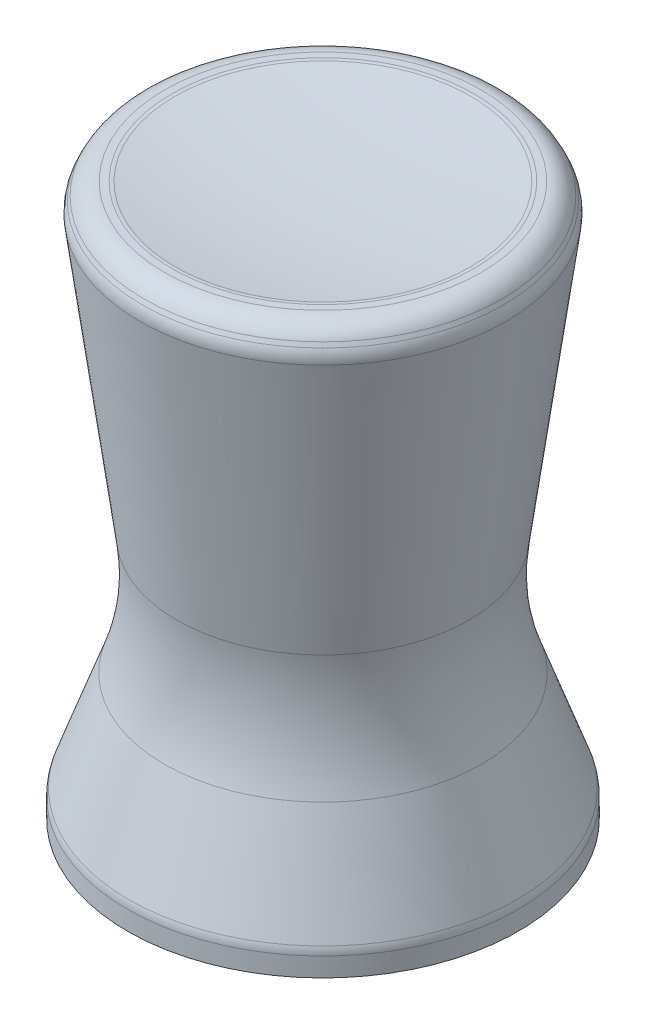
ISO-10303-21;
HEADER;
FILE_DESCRIPTION(('STEP AP214'),'2;1');
FILE_NAME('part.step','',(''),(''),'','','');
FILE_SCHEMA(('AUTOMOTIVE_DESIGN { 1 0 10303 214 1 1 1 1 }'));
ENDSEC;
DATA;
#1=APPLICATION_CONTEXT('core data for automotive mechanical design processes');
#2=APPLICATION_PROTOCOL_DEFINITION('international standard','automotive_design',2000,#1);
#3=PRODUCT_CONTEXT('',#1,'mechanical');
#4=PRODUCT('Part','Part','',(#3));
#5=PRODUCT_RELATED_PRODUCT_CATEGORY('part','',(#4));
#6=PRODUCT_DEFINITION_FORMATION('','',#4);
#7=PRODUCT_DEFINITION_CONTEXT('part definition',#1,'design');
#8=PRODUCT_DEFINITION('design','',#6,#7);
#9=PRODUCT_DEFINITION_SHAPE('','',#8);
#10=(LENGTH_UNIT() NAMED_UNIT(*) SI_UNIT(.MILLI.,.METRE.));
#11=(NAMED_UNIT(*) PLANE_ANGLE_UNIT() SI_UNIT($,.RADIAN.));
#12=(NAMED_UNIT(*) SI_UNIT($,.STERADIAN.) SOLID_ANGLE_UNIT());
#13=UNCERTAINTY_MEASURE_WITH_UNIT(LENGTH_MEASURE(1.E-05),#10,'distance_accuracy_value','');
#14=(GEOMETRIC_REPRESENTATION_CONTEXT(3) GLOBAL_UNCERTAINTY_ASSIGNED_CONTEXT((#13)) GLOBAL_UNIT_ASSIGNED_CONTEXT((#10,
#11,#12)) REPRESENTATION_CONTEXT('',''));
#15=CARTESIAN_POINT('',(0.,0.,0.));
#16=DIRECTION('',(0.,0.,1.));
#17=DIRECTION('',(1.,0.,0.));
#18=AXIS2_PLACEMENT_3D('',#15,#16,#17);
#19=CARTESIAN_POINT('',(0.,17.75,0.));
#20=DIRECTION('',(0.,1.,0.));
#21=DIRECTION('',(-1.,0.,0.));
#22=AXIS2_PLACEMENT_3D('',#19,#20,#21);
#23=CYLINDRICAL_SURFACE('',#22,3.05);
#24=CARTESIAN_POINT('',(0.,7.325,0.));
#25=DIRECTION('',(0.,1.,0.));
#26=DIRECTION('',(-1.,0.,0.));
#27=AXIS2_PLACEMENT_3D('',#24,#25,#26);
#28=CIRCLE('',#27,3.05);
#29=CARTESIAN_POINT('',(-0.0999865618490288,7.325,-3.04836065573771));
#30=VERTEX_POINT('',#29);
#31=CARTESIAN_POINT('',(-2.42487113059643,7.325,1.85));
#32=VERTEX_POINT('',#31);
#33=EDGE_CURVE('E48',#30,#32,#28,.T.);
#34=ORIENTED_EDGE('',*,*,#33,.F.);
#35=DIRECTION('',(0.,1.,0.));
#36=VECTOR('',#35,1.);
#37=CARTESIAN_POINT('',(-0.0999865618490289,12.5375,-3.04836065573771));
#38=LINE('',#37,#36);
#39=CARTESIAN_POINT('',(-0.0999865618490289,17.75,-3.04836065573771));
#40=VERTEX_POINT('',#39);
#41=EDGE_CURVE('E92',#30,#40,#38,.T.);
#42=ORIENTED_EDGE('',*,*,#41,.T.);
#43=CARTESIAN_POINT('',(0.,17.75,0.));
#44=DIRECTION('',(0.,1.,0.));
#45=DIRECTION('',(-1.,0.,0.));
#46=AXIS2_PLACEMENT_3D('',#43,#44,#45);
#47=CIRCLE('',#46,3.05);
#48=CARTESIAN_POINT('',(-2.6556543449779,17.75,1.5));
#49=VERTEX_POINT('',#48);
#50=EDGE_CURVE('E332',#40,#49,#47,.T.);
#51=ORIENTED_EDGE('',*,*,#50,.T.);
#52=DIRECTION('',(0.,1.,0.));
#53=VECTOR('',#52,1.);
#54=CARTESIAN_POINT('',(-2.6556543449779,1.17520325539127,1.5));
#55=LINE('',#54,#53);
#56=CARTESIAN_POINT('',(-2.6556543449779,7.675,1.5));
#57=VERTEX_POINT('',#56);
#58=EDGE_CURVE('E336',#57,#49,#55,.T.);
#59=ORIENTED_EDGE('',*,*,#58,.F.);
#60=CARTESIAN_POINT('',(0.,9.175,0.));
#61=DIRECTION('',(0.,0.707106781186547,0.707106781186547));
#62=DIRECTION('',(0.,0.707106781186548,-0.707106781186548));
#63=AXIS2_PLACEMENT_3D('',#60,#61,#62);
#64=ELLIPSE('',#63,4.31335136523794,3.05);
#65=EDGE_CURVE('E42',#57,#32,#64,.T.);
#66=ORIENTED_EDGE('',*,*,#65,.T.);
#67=EDGE_LOOP('',(#34,#42,#51,#59,#66));
#68=FACE_BOUND('',#67,.T.);
#69=ADVANCED_FACE('F33',(#68),#23,.F.);
#70=CARTESIAN_POINT('',(2.6556543449779,17.75,1.5));
#71=VERTEX_POINT('',#70);
#72=CARTESIAN_POINT('',(0.0999865618490288,17.75,-3.04836065573771));
#73=VERTEX_POINT('',#72);
#74=EDGE_CURVE('E100',#71,#73,#47,.T.);
#75=ORIENTED_EDGE('',*,*,#74,.T.);
#76=DIRECTION('',(0.,1.,0.));
#77=VECTOR('',#76,1.);
#78=CARTESIAN_POINT('',(0.0999865618490288,12.5375,-3.04836065573771));
#79=LINE('',#78,#77);
#80=CARTESIAN_POINT('',(0.0999865618490288,7.325,-3.04836065573771));
#81=VERTEX_POINT('',#80);
#82=EDGE_CURVE('E89',#73,#81,#79,.F.);
#83=ORIENTED_EDGE('',*,*,#82,.T.);
#84=CARTESIAN_POINT('',(2.42487113059643,7.325,1.85));
#85=VERTEX_POINT('',#84);
#86=EDGE_CURVE('E84',#85,#81,#28,.T.);
#87=ORIENTED_EDGE('',*,*,#86,.F.);
#88=CARTESIAN_POINT('',(0.,9.175,0.));
#89=DIRECTION('',(0.,0.707106781186547,0.707106781186547));
#90=DIRECTION('',(0.,0.707106781186548,-0.707106781186548));
#91=AXIS2_PLACEMENT_3D('',#88,#89,#90);
#92=ELLIPSE('',#91,4.31335136523794,3.05);
#93=CARTESIAN_POINT('',(2.6556543449779,7.675,1.5));
#94=VERTEX_POINT('',#93);
#95=EDGE_CURVE('E11',#85,#94,#92,.T.);
#96=ORIENTED_EDGE('',*,*,#95,.T.);
#97=DIRECTION('',(0.,1.,0.));
#98=VECTOR('',#97,1.);
#99=CARTESIAN_POINT('',(2.6556543449779,1.17520325539127,1.5));
#100=LINE('',#99,#98);
#101=EDGE_CURVE('E337',#94,#71,#100,.T.);
#102=ORIENTED_EDGE('',*,*,#101,.T.);
#103=EDGE_LOOP('',(#75,#83,#87,#96,#102));
#104=FACE_BOUND('',#103,.T.);
#105=ADVANCED_FACE('F97',(#104),#23,.F.);
#106=CARTESIAN_POINT('',(3.05,17.75,0.));
#107=DIRECTION('',(0.,-1.,0.));
#108=DIRECTION('',(1.,0.,0.));
#109=AXIS2_PLACEMENT_3D('',#106,#107,#108);
#110=PLANE('',#109);
#111=ORIENTED_EDGE('',*,*,#50,.F.);
#112=CARTESIAN_POINT('',(0.,17.75,-3.05));
#113=DIRECTION('',(0.,-1.,0.));
#114=DIRECTION('',(1.,0.,0.));
#115=AXIS2_PLACEMENT_3D('',#112,#113,#114);
#116=CIRCLE('',#115,0.1);
#117=EDGE_CURVE('E93',#73,#40,#116,.T.);
#118=ORIENTED_EDGE('',*,*,#117,.F.);
#119=ORIENTED_EDGE('',*,*,#74,.F.);
#120=DIRECTION('',(1.,0.,0.));
#121=VECTOR('',#120,1.);
#122=CARTESIAN_POINT('',(-2.6556543449779,17.75,1.5));
#123=LINE('',#122,#121);
#124=EDGE_CURVE('E334',#49,#71,#123,.T.);
#125=ORIENTED_EDGE('',*,*,#124,.F.);
#126=EDGE_LOOP('',(#111,#118,#119,#125));
#127=FACE_BOUND('',#126,.T.);
#128=ADVANCED_FACE('F156',(#127),#110,.T.);
#129=CARTESIAN_POINT('',(0.,0.,0.));
#130=DIRECTION('',(0.,1.,0.));
#131=DIRECTION('',(-1.,0.,0.));
#132=AXIS2_PLACEMENT_3D('',#129,#130,#131);
#133=PLANE('',#132);
#134=CARTESIAN_POINT('',(0.,0.,0.));
#135=DIRECTION('',(0.,1.,0.));
#136=DIRECTION('',(-1.,0.,0.));
#137=AXIS2_PLACEMENT_3D('',#134,#135,#136);
#138=CIRCLE('',#137,3.875);
#139=CARTESIAN_POINT('',(-3.875,0.,0.));
#140=VERTEX_POINT('',#139);
#141=EDGE_CURVE('E112',#140,#140,#138,.T.);
#142=ORIENTED_EDGE('',*,*,#141,.T.);
#143=EDGE_LOOP('',(#142));
#144=FACE_BOUND('',#143,.T.);
#145=CARTESIAN_POINT('',(0.,0.,0.));
#146=DIRECTION('',(0.,1.,0.));
#147=DIRECTION('',(-1.,0.,0.));
#148=AXIS2_PLACEMENT_3D('',#145,#146,#147);
#149=CIRCLE('',#148,8.5);
#150=CARTESIAN_POINT('',(-8.5,0.,0.));
#151=VERTEX_POINT('',#150);
#152=EDGE_CURVE('E115',#151,#151,#149,.T.);
#153=ORIENTED_EDGE('',*,*,#152,.F.);
#154=EDGE_LOOP('',(#153));
#155=FACE_BOUND('',#154,.T.);
#156=ADVANCED_FACE('F152',(#144,#155),#133,.F.);
#157=CARTESIAN_POINT('',(0.,23.5,0.));
#158=DIRECTION('',(0.,1.,0.));
#159=DIRECTION('',(-1.,0.,0.));
#160=AXIS2_PLACEMENT_3D('',#157,#158,#159);
#161=CYLINDRICAL_SURFACE('',#160,8.5);
#162=CARTESIAN_POINT('',(0.,0.8267862505363,0.));
#163=DIRECTION('',(0.,-1.,0.));
#164=DIRECTION('',(1.,0.,0.));
#165=AXIS2_PLACEMENT_3D('',#162,#163,#164);
#166=CIRCLE('',#165,8.5);
#167=CARTESIAN_POINT('',(8.5,0.8267862505363,0.));
#168=VERTEX_POINT('',#167);
#169=EDGE_CURVE('E369',#168,#168,#166,.T.);
#170=ORIENTED_EDGE('',*,*,#169,.T.);
#171=EDGE_LOOP('',(#170));
#172=FACE_BOUND('',#171,.T.);
#173=ORIENTED_EDGE('',*,*,#152,.T.);
#174=EDGE_LOOP('',(#173));
#175=FACE_BOUND('',#174,.T.);
#176=ADVANCED_FACE('F148',(#172,#175),#161,.T.);
#177=CARTESIAN_POINT('',(0.,1.,0.));
#178=DIRECTION('',(0.,-1.,0.));
#179=DIRECTION('',(1.,0.,0.));
#180=AXIS2_PLACEMENT_3D('',#177,#178,#179);
#181=CONICAL_SURFACE('',#180,8.5,0.343023940420704);
#182=CARTESIAN_POINT('',(0.,1.16312264753446,0.));
#183=DIRECTION('',(0.,1.,0.));
#184=DIRECTION('',(-1.,0.,0.));
#185=AXIS2_PLACEMENT_3D('',#182,#183,#184);
#186=CIRCLE('',#185,8.44174191159484);
#187=CARTESIAN_POINT('',(-8.44174191159484,1.16312264753446,0.));
#188=VERTEX_POINT('',#187);
#189=EDGE_CURVE('E372',#188,#188,#186,.T.);
#190=ORIENTED_EDGE('',*,*,#189,.T.);
#191=EDGE_LOOP('',(#190));
#192=FACE_BOUND('',#191,.T.);
#193=CARTESIAN_POINT('',(0.,5.48921678780313,0.));
#194=DIRECTION('',(0.,-1.,0.));
#195=DIRECTION('',(1.,0.,0.));
#196=AXIS2_PLACEMENT_3D('',#193,#194,#195);
#197=CIRCLE('',#196,6.89670829007031);
#198=CARTESIAN_POINT('',(6.89670829007031,5.48921678780313,0.));
#199=VERTEX_POINT('',#198);
#200=EDGE_CURVE('E375',#199,#199,#197,.T.);
#201=ORIENTED_EDGE('',*,*,#200,.T.);
#202=EDGE_LOOP('',(#201));
#203=FACE_BOUND('',#202,.T.);
#204=ADVANCED_FACE('F144',(#192,#203),#181,.T.);
#205=CARTESIAN_POINT('',(0.,8.,0.));
#206=DIRECTION('',(0.,1.,0.));
#207=DIRECTION('',(-1.,0.,0.));
#208=AXIS2_PLACEMENT_3D('',#205,#206,#207);
#209=CONICAL_SURFACE('',#208,6.,0.132551532296674);
#210=CARTESIAN_POINT('',(0.,22.6954400819272,0.));
#211=DIRECTION('',(0.,-1.,0.));
#212=DIRECTION('',(1.,0.,0.));
#213=AXIS2_PLACEMENT_3D('',#210,#211,#212);
#214=CIRCLE('',#213,7.95939201092363);
#215=CARTESIAN_POINT('',(7.95939201092363,22.6954400819272,0.));
#216=VERTEX_POINT('',#215);
#217=EDGE_CURVE('E349',#216,#216,#214,.T.);
#218=ORIENTED_EDGE('',*,*,#217,.T.);
#219=EDGE_LOOP('',(#218));
#220=FACE_BOUND('',#219,.T.);
#221=CARTESIAN_POINT('',(0.,10.6427180757841,0.));
#222=DIRECTION('',(0.,1.,0.));
#223=DIRECTION('',(-1.,0.,0.));
#224=AXIS2_PLACEMENT_3D('',#221,#222,#223);
#225=CIRCLE('',#224,6.35236241010454);
#226=CARTESIAN_POINT('',(-6.35236241010454,10.6427180757841,0.));
#227=VERTEX_POINT('',#226);
#228=EDGE_CURVE('E377',#227,#227,#225,.T.);
#229=ORIENTED_EDGE('',*,*,#228,.T.);
#230=EDGE_LOOP('',(#229));
#231=FACE_BOUND('',#230,.T.);
#232=ADVANCED_FACE('F140',(#220,#231),#209,.T.);
#233=CARTESIAN_POINT('',(0.,23.,0.));
#234=DIRECTION('',(0.,-1.,0.));
#235=DIRECTION('',(1.,0.,0.));
#236=AXIS2_PLACEMENT_3D('',#233,#234,#235);
#237=CONICAL_SURFACE('',#236,8.,0.463647609000806);
#238=CARTESIAN_POINT('',(0.,23.4472135955,0.));
#239=DIRECTION('',(0.,1.,0.));
#240=DIRECTION('',(-1.,0.,0.));
#241=AXIS2_PLACEMENT_3D('',#238,#239,#240);
#242=CIRCLE('',#241,7.77639320225002);
#243=CARTESIAN_POINT('',(-7.77639320225002,23.4472135955,0.));
#244=VERTEX_POINT('',#243);
#245=EDGE_CURVE('E354',#244,#244,#242,.F.);
#246=ORIENTED_EDGE('',*,*,#245,.T.);
#247=EDGE_LOOP('',(#246));
#248=FACE_BOUND('',#247,.T.);
#249=CARTESIAN_POINT('',(0.,23.2748173975182,0.));
#250=DIRECTION('',(0.,1.,0.));
#251=DIRECTION('',(-1.,0.,0.));
#252=AXIS2_PLACEMENT_3D('',#249,#250,#251);
#253=CIRCLE('',#252,7.86259130124091);
#254=CARTESIAN_POINT('',(-7.86259130124091,23.2748173975182,0.));
#255=VERTEX_POINT('',#254);
#256=EDGE_CURVE('E357',#255,#255,#253,.T.);
#257=ORIENTED_EDGE('',*,*,#256,.T.);
#258=EDGE_LOOP('',(#257));
#259=FACE_BOUND('',#258,.T.);
#260=ADVANCED_FACE('F136',(#248,#259),#237,.T.);
#261=CARTESIAN_POINT('',(7.5,24.,0.));
#262=DIRECTION('',(0.,-1.,0.));
#263=DIRECTION('',(1.,0.,0.));
#264=AXIS2_PLACEMENT_3D('',#261,#262,#263);
#265=PLANE('',#264);
#266=CARTESIAN_POINT('',(0.,24.,0.));
#267=DIRECTION('',(0.,-1.,0.));
#268=DIRECTION('',(1.,0.,0.));
#269=AXIS2_PLACEMENT_3D('',#266,#267,#268);
#270=CIRCLE('',#269,6.57647577481777);
#271=CARTESIAN_POINT('',(6.57647577481777,24.,0.));
#272=VERTEX_POINT('',#271);
#273=EDGE_CURVE('E360',#272,#272,#270,.T.);
#274=ORIENTED_EDGE('',*,*,#273,.T.);
#275=EDGE_LOOP('',(#274));
#276=FACE_BOUND('',#275,.T.);
#277=CARTESIAN_POINT('',(0.,24.,0.));
#278=DIRECTION('',(0.,-1.,0.));
#279=DIRECTION('',(1.,0.,0.));
#280=AXIS2_PLACEMENT_3D('',#277,#278,#279);
#281=CIRCLE('',#280,6.88196601125011);
#282=CARTESIAN_POINT('',(6.88196601125011,24.,0.));
#283=VERTEX_POINT('',#282);
#284=EDGE_CURVE('E363',#283,#283,#281,.F.);
#285=ORIENTED_EDGE('',*,*,#284,.T.);
#286=EDGE_LOOP('',(#285));
#287=FACE_BOUND('',#286,.T.);
#288=ADVANCED_FACE('F130',(#276,#287),#265,.F.);
#289=CARTESIAN_POINT('',(6.5,24.,0.));
#290=CARTESIAN_POINT('',(3.26923076923077,23.5,0.));
#291=CARTESIAN_POINT('',(0.,23.5,0.));
#292=B_SPLINE_CURVE_WITH_KNOTS('',2,(#289,#290,#291),.UNSPECIFIED.,.F.,.F.,(3,3),(0.,1.),.UNSPECIFIED.);
#293=CARTESIAN_POINT('',(0.,23.5,0.));
#294=DIRECTION('',(0.,1.,0.));
#295=AXIS1_PLACEMENT('',#293,#294);
#296=SURFACE_OF_REVOLUTION('',#292,#295);
#297=CARTESIAN_POINT('',(0.,23.9885042456978,0.));
#298=DIRECTION('',(0.,1.,0.));
#299=DIRECTION('',(-1.,0.,0.));
#300=AXIS2_PLACEMENT_3D('',#297,#298,#299);
#301=CIRCLE('',#300,6.42528266572417);
#302=CARTESIAN_POINT('',(-6.42528266572417,23.9885042456978,0.));
#303=VERTEX_POINT('',#302);
#304=EDGE_CURVE('E366',#303,#303,#301,.T.);
#305=ORIENTED_EDGE('',*,*,#304,.T.);
#306=EDGE_LOOP('',(#305));
#307=FACE_BOUND('',#306,.T.);
#308=CARTESIAN_POINT('',(0.,23.5,0.));
#309=VERTEX_POINT('',#308);
#310=VERTEX_LOOP('',#309);
#311=FACE_BOUND('',#310,.T.);
#312=ADVANCED_FACE('F125',(#307,#311),#296,.T.);
#313=CARTESIAN_POINT('',(0.,9.18891715478285,0.));
#314=DIRECTION('',(0.,1.,0.));
#315=DIRECTION('',(-1.,0.,0.));
#316=AXIS2_PLACEMENT_3D('',#313,#314,#315);
#317=TOROIDAL_SURFACE('',#316,17.2558693176135,11.);
#318=ORIENTED_EDGE('',*,*,#200,.F.);
#319=EDGE_LOOP('',(#318));
#320=FACE_BOUND('',#319,.T.);
#321=ORIENTED_EDGE('',*,*,#228,.F.);
#322=EDGE_LOOP('',(#321));
#323=FACE_BOUND('',#322,.T.);
#324=ADVANCED_FACE('F129',(#320,#323),#317,.F.);
#325=CARTESIAN_POINT('',(0.,0.8267862505363,0.));
#326=DIRECTION('',(0.,-1.,0.));
#327=DIRECTION('',(1.,0.,0.));
#328=AXIS2_PLACEMENT_3D('',#325,#326,#327);
#329=TOROIDAL_SURFACE('',#328,7.5,1.);
#330=ORIENTED_EDGE('',*,*,#169,.F.);
#331=EDGE_LOOP('',(#330));
#332=FACE_BOUND('',#331,.T.);
#333=ORIENTED_EDGE('',*,*,#189,.F.);
#334=EDGE_LOOP('',(#333));
#335=FACE_BOUND('',#334,.T.);
#336=ADVANCED_FACE('F160',(#332,#335),#329,.T.);
#337=CARTESIAN_POINT('',(0.,23.,0.));
#338=DIRECTION('',(0.,1.,0.));
#339=DIRECTION('',(-1.,0.,0.));
#340=AXIS2_PLACEMENT_3D('',#337,#338,#339);
#341=TOROIDAL_SURFACE('',#340,6.57647577481777,1.);
#342=ORIENTED_EDGE('',*,*,#273,.F.);
#343=EDGE_LOOP('',(#342));
#344=FACE_BOUND('',#343,.T.);
#345=ORIENTED_EDGE('',*,*,#304,.F.);
#346=EDGE_LOOP('',(#345));
#347=FACE_BOUND('',#346,.T.);
#348=ADVANCED_FACE('F164',(#344,#347),#341,.T.);
#349=CARTESIAN_POINT('',(0.,23.,0.));
#350=DIRECTION('',(0.,-1.,0.));
#351=DIRECTION('',(1.,0.,0.));
#352=AXIS2_PLACEMENT_3D('',#349,#350,#351);
#353=TOROIDAL_SURFACE('',#352,6.88196601125011,1.);
#354=ORIENTED_EDGE('',*,*,#245,.F.);
#355=EDGE_LOOP('',(#354));
#356=FACE_BOUND('',#355,.T.);
#357=ORIENTED_EDGE('',*,*,#284,.F.);
#358=EDGE_LOOP('',(#357));
#359=FACE_BOUND('',#358,.T.);
#360=ADVANCED_FACE('F168',(#356,#359),#353,.T.);
#361=CARTESIAN_POINT('',(0.,22.8276038020182,0.));
#362=DIRECTION('',(0.,-1.,0.));
#363=DIRECTION('',(1.,0.,0.));
#364=AXIS2_PLACEMENT_3D('',#361,#362,#363);
#365=TOROIDAL_SURFACE('',#364,6.96816411024099,1.);
#366=ORIENTED_EDGE('',*,*,#217,.F.);
#367=EDGE_LOOP('',(#366));
#368=FACE_BOUND('',#367,.T.);
#369=ORIENTED_EDGE('',*,*,#256,.F.);
#370=EDGE_LOOP('',(#369));
#371=FACE_BOUND('',#370,.T.);
#372=ADVANCED_FACE('F171',(#368,#371),#365,.T.);
#373=CARTESIAN_POINT('',(0.,17.75,0.));
#374=DIRECTION('',(0.,1.,0.));
#375=DIRECTION('',(-1.,0.,0.));
#376=AXIS2_PLACEMENT_3D('',#373,#374,#375);
#377=CYLINDRICAL_SURFACE('',#376,3.875);
#378=CARTESIAN_POINT('',(0.,6.5,0.));
#379=DIRECTION('',(0.,1.,0.));
#380=DIRECTION('',(-1.,0.,0.));
#381=AXIS2_PLACEMENT_3D('',#378,#379,#380);
#382=CIRCLE('',#381,3.875);
#383=CARTESIAN_POINT('',(-3.875,6.5,0.));
#384=VERTEX_POINT('',#383);
#385=EDGE_CURVE('E106',#384,#384,#382,.T.);
#386=ORIENTED_EDGE('',*,*,#385,.T.);
#387=EDGE_LOOP('',(#386));
#388=FACE_BOUND('',#387,.T.);
#389=ORIENTED_EDGE('',*,*,#141,.F.);
#390=EDGE_LOOP('',(#389));
#391=FACE_BOUND('',#390,.T.);
#392=ADVANCED_FACE('F132',(#388,#391),#377,.F.);
#393=CARTESIAN_POINT('',(0.,6.5,0.));
#394=DIRECTION('',(0.,-1.,0.));
#395=DIRECTION('',(1.,0.,0.));
#396=AXIS2_PLACEMENT_3D('',#393,#394,#395);
#397=CONICAL_SURFACE('',#396,3.875,0.785398163397448);
#398=ORIENTED_EDGE('',*,*,#33,.T.);
#399=EDGE_CURVE('E104',#32,#85,#28,.T.);
#400=ORIENTED_EDGE('',*,*,#399,.T.);
#401=ORIENTED_EDGE('',*,*,#86,.T.);
#402=EDGE_CURVE('E78',#81,#30,#28,.T.);
#403=ORIENTED_EDGE('',*,*,#402,.T.);
#404=EDGE_LOOP('',(#398,#400,#401,#403));
#405=FACE_BOUND('',#404,.T.);
#406=ORIENTED_EDGE('',*,*,#385,.F.);
#407=EDGE_LOOP('',(#406));
#408=FACE_BOUND('',#407,.T.);
#409=ADVANCED_FACE('F102',(#405,#408),#397,.F.);
#410=CARTESIAN_POINT('',(0.,7.325,0.));
#411=DIRECTION('',(0.,1.,0.));
#412=DIRECTION('',(0.,0.,1.));
#413=AXIS2_PLACEMENT_3D('',#410,#411,#412);
#414=PLANE('',#413);
#415=ORIENTED_EDGE('',*,*,#399,.F.);
#416=DIRECTION('',(1.,0.,0.));
#417=VECTOR('',#416,1.);
#418=CARTESIAN_POINT('',(0.,7.325,1.85));
#419=LINE('',#418,#417);
#420=EDGE_CURVE('E346',#32,#85,#419,.T.);
#421=ORIENTED_EDGE('',*,*,#420,.T.);
#422=EDGE_LOOP('',(#415,#421));
#423=FACE_BOUND('',#422,.T.);
#424=ADVANCED_FACE('F190',(#423),#414,.F.);
#425=CARTESIAN_POINT('',(-2.6556543449779,1.17520325539127,1.5));
#426=DIRECTION('',(0.,0.,1.));
#427=DIRECTION('',(1.,0.,0.));
#428=AXIS2_PLACEMENT_3D('',#425,#426,#427);
#429=PLANE('',#428);
#430=ORIENTED_EDGE('',*,*,#101,.F.);
#431=DIRECTION('',(-1.,0.,0.));
#432=VECTOR('',#431,1.);
#433=CARTESIAN_POINT('',(-2.6556543449779,7.675,1.5));
#434=LINE('',#433,#432);
#435=EDGE_CURVE('E347',#94,#57,#434,.T.);
#436=ORIENTED_EDGE('',*,*,#435,.T.);
#437=ORIENTED_EDGE('',*,*,#58,.T.);
#438=ORIENTED_EDGE('',*,*,#124,.T.);
#439=EDGE_LOOP('',(#430,#436,#437,#438));
#440=FACE_BOUND('',#439,.T.);
#441=ADVANCED_FACE('F194',(#440),#429,.F.);
#442=CARTESIAN_POINT('',(0.,7.325,0.));
#443=DIRECTION('',(0.,1.,0.));
#444=DIRECTION('',(0.,0.,1.));
#445=AXIS2_PLACEMENT_3D('',#442,#443,#444);
#446=PLANE('',#445);
#447=ORIENTED_EDGE('',*,*,#402,.F.);
#448=CARTESIAN_POINT('',(0.,7.325,-3.05));
#449=DIRECTION('',(0.,1.,0.));
#450=DIRECTION('',(0.,0.,1.));
#451=AXIS2_PLACEMENT_3D('',#448,#449,#450);
#452=CIRCLE('',#451,0.1);
#453=EDGE_CURVE('E81',#30,#81,#452,.T.);
#454=ORIENTED_EDGE('',*,*,#453,.F.);
#455=EDGE_LOOP('',(#447,#454));
#456=FACE_BOUND('',#455,.T.);
#457=ADVANCED_FACE('F80',(#456),#446,.F.);
#458=CARTESIAN_POINT('',(0.,1.17520325539127,-3.05));
#459=DIRECTION('',(0.,1.,0.));
#460=DIRECTION('',(-1.,0.,0.));
#461=AXIS2_PLACEMENT_3D('',#458,#459,#460);
#462=CYLINDRICAL_SURFACE('',#461,0.1);
#463=ORIENTED_EDGE('',*,*,#41,.F.);
#464=ORIENTED_EDGE('',*,*,#453,.T.);
#465=ORIENTED_EDGE('',*,*,#82,.F.);
#466=ORIENTED_EDGE('',*,*,#117,.T.);
#467=EDGE_LOOP('',(#463,#464,#465,#466));
#468=FACE_BOUND('',#467,.T.);
#469=ADVANCED_FACE('F88',(#468),#462,.T.);
#470=CARTESIAN_POINT('',(-2.6556543449779,7.675,1.5));
#471=DIRECTION('',(0.,0.707106781186547,0.707106781186547));
#472=DIRECTION('',(-1.,0.,0.));
#473=AXIS2_PLACEMENT_3D('',#470,#471,#472);
#474=PLANE('',#473);
#475=ORIENTED_EDGE('',*,*,#95,.F.);
#476=ORIENTED_EDGE('',*,*,#420,.F.);
#477=ORIENTED_EDGE('',*,*,#65,.F.);
#478=ORIENTED_EDGE('',*,*,#435,.F.);
#479=EDGE_LOOP('',(#475,#476,#477,#478));
#480=FACE_BOUND('',#479,.T.);
#481=ADVANCED_FACE('F35',(#480),#474,.F.);
#482=CLOSED_SHELL('',(#69,#105,#128,#156,#176,#204,#232,#260,#288,#312,#324,#336,#348,#360,#372,
#392,#409,#424,#441,#457,#469,#481));
#483=MANIFOLD_SOLID_BREP('B2',#482);
#484=ADVANCED_BREP_SHAPE_REPRESENTATION('',(#18,#483),#14);
#485=SHAPE_DEFINITION_REPRESENTATION(#9,#484);
ENDSEC;
END-ISO-10303-21;
